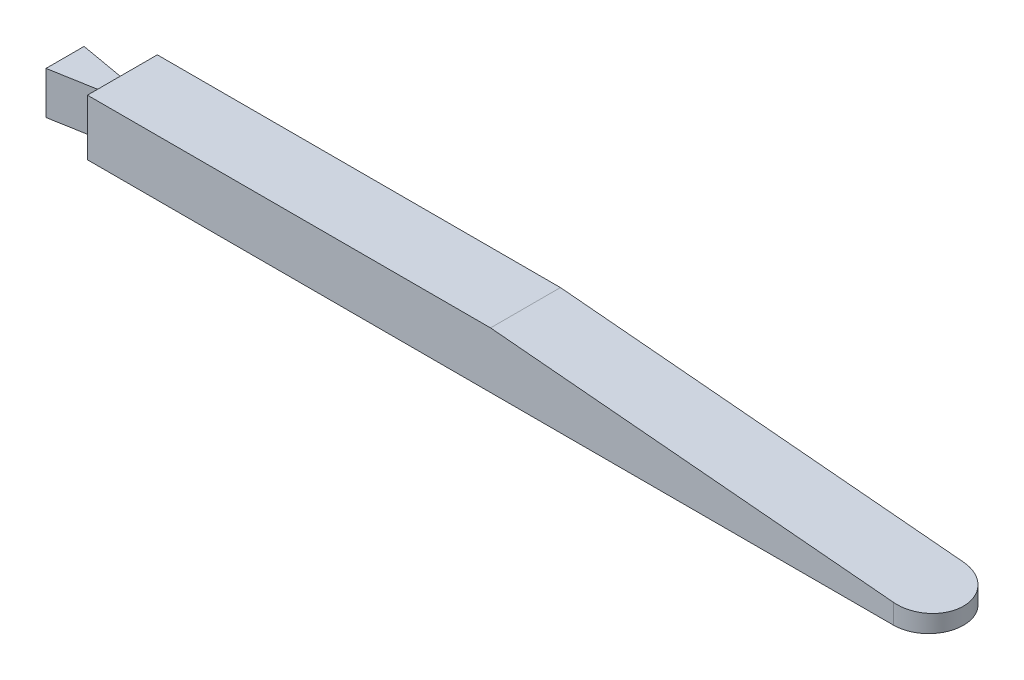
ISO-10303-21;
HEADER;
FILE_DESCRIPTION(('STEP AP214'),'2;1');
FILE_NAME('part.step','',(''),(''),'','','');
FILE_SCHEMA(('AUTOMOTIVE_DESIGN { 1 0 10303 214 1 1 1 1 }'));
ENDSEC;
DATA;
#1=APPLICATION_CONTEXT('core data for automotive mechanical design processes');
#2=APPLICATION_PROTOCOL_DEFINITION('international standard','automotive_design',2000,#1);
#3=PRODUCT_CONTEXT('',#1,'mechanical');
#4=PRODUCT('Part','Part','',(#3));
#5=PRODUCT_RELATED_PRODUCT_CATEGORY('part','',(#4));
#6=PRODUCT_DEFINITION_FORMATION('','',#4);
#7=PRODUCT_DEFINITION_CONTEXT('part definition',#1,'design');
#8=PRODUCT_DEFINITION('design','',#6,#7);
#9=PRODUCT_DEFINITION_SHAPE('','',#8);
#10=(LENGTH_UNIT() NAMED_UNIT(*) SI_UNIT(.MILLI.,.METRE.));
#11=(NAMED_UNIT(*) PLANE_ANGLE_UNIT() SI_UNIT($,.RADIAN.));
#12=(NAMED_UNIT(*) SI_UNIT($,.STERADIAN.) SOLID_ANGLE_UNIT());
#13=UNCERTAINTY_MEASURE_WITH_UNIT(LENGTH_MEASURE(1.E-05),#10,'distance_accuracy_value','');
#14=(GEOMETRIC_REPRESENTATION_CONTEXT(3) GLOBAL_UNCERTAINTY_ASSIGNED_CONTEXT((#13)) GLOBAL_UNIT_ASSIGNED_CONTEXT((#10,
#11,#12)) REPRESENTATION_CONTEXT('',''));
#15=CARTESIAN_POINT('',(0.,0.,0.));
#16=DIRECTION('',(0.,0.,1.));
#17=DIRECTION('',(1.,0.,0.));
#18=AXIS2_PLACEMENT_3D('',#15,#16,#17);
#19=CARTESIAN_POINT('',(-18.2117687991643,31.75,9.91489000000021));
#20=DIRECTION('',(-0.173648177666927,0.,0.984807753012209));
#21=DIRECTION('',(0.984807753012209,0.,0.173648177666927));
#22=AXIS2_PLACEMENT_3D('',#19,#20,#21);
#23=PLANE('',#22);
#24=DIRECTION('',(-0.984807753012209,0.,-0.173648177666927));
#25=VECTOR('',#24,1.);
#26=CARTESIAN_POINT('',(14.3002312008357,24.13,15.6476327967937));
#27=LINE('',#26,#25);
#28=CARTESIAN_POINT('',(14.3002312008357,24.13,15.6476327967937));
#29=VERTEX_POINT('',#28);
#30=CARTESIAN_POINT('',(-18.2117687991643,24.13,9.91489000000021));
#31=VERTEX_POINT('',#30);
#32=EDGE_CURVE('E198',#29,#31,#27,.T.);
#33=ORIENTED_EDGE('',*,*,#32,.F.);
#34=DIRECTION('',(0.,-1.,0.));
#35=VECTOR('',#34,1.);
#36=CARTESIAN_POINT('',(14.3002312008357,31.75,15.6476327967937));
#37=LINE('',#36,#35);
#38=CARTESIAN_POINT('',(14.3002312008357,0.,15.6476327967937));
#39=VERTEX_POINT('',#38);
#40=EDGE_CURVE('E11',#29,#39,#37,.T.);
#41=ORIENTED_EDGE('',*,*,#40,.T.);
#42=DIRECTION('',(-0.984807753012209,0.,-0.173648177666927));
#43=VECTOR('',#42,1.);
#44=CARTESIAN_POINT('',(-18.2117687991643,0.,9.91489000000021));
#45=LINE('',#44,#43);
#46=CARTESIAN_POINT('',(-18.2117687991643,0.,9.91489000000021));
#47=VERTEX_POINT('',#46);
#48=EDGE_CURVE('E124',#39,#47,#45,.T.);
#49=ORIENTED_EDGE('',*,*,#48,.T.);
#50=DIRECTION('',(0.,-1.,0.));
#51=VECTOR('',#50,1.);
#52=CARTESIAN_POINT('',(-18.2117687991643,31.75,9.91489000000021));
#53=LINE('',#52,#51);
#54=EDGE_CURVE('E53',#31,#47,#53,.T.);
#55=ORIENTED_EDGE('',*,*,#54,.F.);
#56=EDGE_LOOP('',(#33,#41,#49,#55));
#57=FACE_BOUND('',#56,.T.);
#58=ADVANCED_FACE('F45',(#57),#23,.F.);
#59=CARTESIAN_POINT('',(-18.2117687991643,31.75,9.91489000000021));
#60=DIRECTION('',(1.,0.,0.));
#61=DIRECTION('',(0.,0.,-1.));
#62=AXIS2_PLACEMENT_3D('',#59,#60,#61);
#63=PLANE('',#62);
#64=DIRECTION('',(0.,0.,1.));
#65=VECTOR('',#64,1.);
#66=CARTESIAN_POINT('',(-18.2117687991643,24.13,9.91489000000021));
#67=LINE('',#66,#65);
#68=CARTESIAN_POINT('',(-18.2117687991643,24.13,31.5048900000002));
#69=VERTEX_POINT('',#68);
#70=EDGE_CURVE('E177',#31,#69,#67,.T.);
#71=ORIENTED_EDGE('',*,*,#70,.F.);
#72=ORIENTED_EDGE('',*,*,#54,.T.);
#73=DIRECTION('',(0.,0.,1.));
#74=VECTOR('',#73,1.);
#75=CARTESIAN_POINT('',(-18.2117687991643,0.,9.91489000000021));
#76=LINE('',#75,#74);
#77=CARTESIAN_POINT('',(-18.2117687991643,0.,31.5048900000002));
#78=VERTEX_POINT('',#77);
#79=EDGE_CURVE('E130',#47,#78,#76,.T.);
#80=ORIENTED_EDGE('',*,*,#79,.T.);
#81=DIRECTION('',(0.,-1.,0.));
#82=VECTOR('',#81,1.);
#83=CARTESIAN_POINT('',(-18.2117687991643,31.75,31.5048900000002));
#84=LINE('',#83,#82);
#85=EDGE_CURVE('E166',#69,#78,#84,.T.);
#86=ORIENTED_EDGE('',*,*,#85,.F.);
#87=EDGE_LOOP('',(#71,#72,#80,#86));
#88=FACE_BOUND('',#87,.T.);
#89=ADVANCED_FACE('F172',(#88),#63,.F.);
#90=CARTESIAN_POINT('',(-18.2117687991643,31.75,31.5048900000002));
#91=DIRECTION('',(-0.173648177666935,0.,-0.984807753012207));
#92=DIRECTION('',(-0.984807753012207,0.,0.173648177666935));
#93=AXIS2_PLACEMENT_3D('',#90,#91,#92);
#94=PLANE('',#93);
#95=DIRECTION('',(0.984807753012207,0.,-0.173648177666935));
#96=VECTOR('',#95,1.);
#97=CARTESIAN_POINT('',(-18.2117687991643,24.13,31.5048900000002));
#98=LINE('',#97,#96);
#99=CARTESIAN_POINT('',(14.3002312008357,24.13,25.7721472032064));
#100=VERTEX_POINT('',#99);
#101=EDGE_CURVE('E133',#69,#100,#98,.T.);
#102=ORIENTED_EDGE('',*,*,#101,.F.);
#103=ORIENTED_EDGE('',*,*,#85,.T.);
#104=DIRECTION('',(0.984807753012207,0.,-0.173648177666935));
#105=VECTOR('',#104,1.);
#106=CARTESIAN_POINT('',(-18.2117687991643,0.,31.5048900000002));
#107=LINE('',#106,#105);
#108=CARTESIAN_POINT('',(14.3002312008357,0.,25.7721472032064));
#109=VERTEX_POINT('',#108);
#110=EDGE_CURVE('E141',#78,#109,#107,.T.);
#111=ORIENTED_EDGE('',*,*,#110,.T.);
#112=DIRECTION('',(0.,-1.,0.));
#113=VECTOR('',#112,1.);
#114=CARTESIAN_POINT('',(14.3002312008357,31.75,25.7721472032064));
#115=LINE('',#114,#113);
#116=EDGE_CURVE('E163',#100,#109,#115,.T.);
#117=ORIENTED_EDGE('',*,*,#116,.F.);
#118=EDGE_LOOP('',(#102,#103,#111,#117));
#119=FACE_BOUND('',#118,.T.);
#120=ADVANCED_FACE('F185',(#119),#94,.F.);
#121=CARTESIAN_POINT('',(14.3002312008357,31.75,40.5218900000002));
#122=DIRECTION('',(1.,0.,0.));
#123=DIRECTION('',(0.,0.,-1.));
#124=AXIS2_PLACEMENT_3D('',#121,#122,#123);
#125=PLANE('',#124);
#126=DIRECTION('',(0.,0.,1.));
#127=VECTOR('',#126,1.);
#128=CARTESIAN_POINT('',(14.3002312008357,0.,40.5218900000002));
#129=LINE('',#128,#127);
#130=CARTESIAN_POINT('',(14.3002312008357,0.,40.5218900000002));
#131=VERTEX_POINT('',#130);
#132=EDGE_CURVE('E145',#109,#131,#129,.T.);
#133=ORIENTED_EDGE('',*,*,#132,.T.);
#134=DIRECTION('',(0.,-1.,0.));
#135=VECTOR('',#134,1.);
#136=CARTESIAN_POINT('',(14.3002312008357,31.75,40.5218900000002));
#137=LINE('',#136,#135);
#138=CARTESIAN_POINT('',(14.3002312008357,31.75,40.5218900000002));
#139=VERTEX_POINT('',#138);
#140=EDGE_CURVE('E159',#139,#131,#137,.T.);
#141=ORIENTED_EDGE('',*,*,#140,.F.);
#142=DIRECTION('',(0.,0.,1.));
#143=VECTOR('',#142,1.);
#144=CARTESIAN_POINT('',(14.3002312008357,31.75,0.897890000000207));
#145=LINE('',#144,#143);
#146=CARTESIAN_POINT('',(14.3002312008357,31.75,0.897890000000207));
#147=VERTEX_POINT('',#146);
#148=EDGE_CURVE('E109',#147,#139,#145,.T.);
#149=ORIENTED_EDGE('',*,*,#148,.F.);
#150=DIRECTION('',(0.,-1.,0.));
#151=VECTOR('',#150,1.);
#152=CARTESIAN_POINT('',(14.3002312008357,31.75,0.897890000000207));
#153=LINE('',#152,#151);
#154=CARTESIAN_POINT('',(14.3002312008357,0.,0.897890000000207));
#155=VERTEX_POINT('',#154);
#156=EDGE_CURVE('E100',#147,#155,#153,.T.);
#157=ORIENTED_EDGE('',*,*,#156,.T.);
#158=DIRECTION('',(0.,0.,1.));
#159=VECTOR('',#158,1.);
#160=CARTESIAN_POINT('',(14.3002312008357,0.,0.897890000000207));
#161=LINE('',#160,#159);
#162=EDGE_CURVE('E116',#155,#39,#161,.T.);
#163=ORIENTED_EDGE('',*,*,#162,.T.);
#164=ORIENTED_EDGE('',*,*,#40,.F.);
#165=DIRECTION('',(0.,0.,-1.));
#166=VECTOR('',#165,1.);
#167=CARTESIAN_POINT('',(14.3002312008357,24.13,25.7721472032064));
#168=LINE('',#167,#166);
#169=EDGE_CURVE('E126',#100,#29,#168,.T.);
#170=ORIENTED_EDGE('',*,*,#169,.F.);
#171=ORIENTED_EDGE('',*,*,#116,.T.);
#172=EDGE_LOOP('',(#133,#141,#149,#157,#163,#164,#170,#171));
#173=FACE_BOUND('',#172,.T.);
#174=ADVANCED_FACE('F114',(#173),#125,.F.);
#175=CARTESIAN_POINT('',(14.3002312008357,31.75,40.5218900000002));
#176=DIRECTION('',(0.,0.,-1.));
#177=DIRECTION('',(-1.,0.,0.));
#178=AXIS2_PLACEMENT_3D('',#175,#176,#177);
#179=PLANE('',#178);
#180=DIRECTION('',(0.,-1.,0.));
#181=VECTOR('',#180,1.);
#182=CARTESIAN_POINT('',(471.500231200836,31.75,40.5218900000002));
#183=LINE('',#182,#181);
#184=CARTESIAN_POINT('',(471.500231200836,11.2057251392889,40.5218900000002));
#185=VERTEX_POINT('',#184);
#186=CARTESIAN_POINT('',(471.500231200836,0.,40.5218900000002));
#187=VERTEX_POINT('',#186);
#188=EDGE_CURVE('E156',#185,#187,#183,.T.);
#189=ORIENTED_EDGE('',*,*,#188,.F.);
#190=DIRECTION('',(0.995985992739676,-0.0895092300623889,0.));
#191=VECTOR('',#190,1.);
#192=CARTESIAN_POINT('',(242.900231200836,31.75,40.5218900000002));
#193=LINE('',#192,#191);
#194=CARTESIAN_POINT('',(242.900231200836,31.75,40.5218900000002));
#195=VERTEX_POINT('',#194);
#196=EDGE_CURVE('E227',#195,#185,#193,.T.);
#197=ORIENTED_EDGE('',*,*,#196,.F.);
#198=DIRECTION('',(1.,0.,0.));
#199=VECTOR('',#198,1.);
#200=CARTESIAN_POINT('',(14.3002312008357,31.75,40.5218900000002));
#201=LINE('',#200,#199);
#202=EDGE_CURVE('E213',#139,#195,#201,.T.);
#203=ORIENTED_EDGE('',*,*,#202,.F.);
#204=ORIENTED_EDGE('',*,*,#140,.T.);
#205=DIRECTION('',(1.,0.,0.));
#206=VECTOR('',#205,1.);
#207=CARTESIAN_POINT('',(14.3002312008357,0.,40.5218900000002));
#208=LINE('',#207,#206);
#209=EDGE_CURVE('E148',#131,#187,#208,.T.);
#210=ORIENTED_EDGE('',*,*,#209,.T.);
#211=EDGE_LOOP('',(#189,#197,#203,#204,#210));
#212=FACE_BOUND('',#211,.T.);
#213=ADVANCED_FACE('F225',(#212),#179,.F.);
#214=CARTESIAN_POINT('',(471.500231200836,31.75,20.7098900000002));
#215=DIRECTION('',(0.,-1.,0.));
#216=DIRECTION('',(0.,0.,-1.));
#217=AXIS2_PLACEMENT_3D('',#214,#215,#216);
#218=CYLINDRICAL_SURFACE('',#217,19.812);
#219=CARTESIAN_POINT('',(471.500231200836,11.2057251392889,20.7098900000002));
#220=DIRECTION('',(-0.0895092300623889,-0.995985992739676,0.));
#221=DIRECTION('',(0.995985992739676,-0.0895092300623889,0.));
#222=AXIS2_PLACEMENT_3D('',#219,#220,#221);
#223=ELLIPSE('',#222,19.8918460143227,19.812);
#224=CARTESIAN_POINT('',(471.500231200836,11.2057251392889,0.8978900000002));
#225=VERTEX_POINT('',#224);
#226=EDGE_CURVE('E200',#225,#185,#223,.T.);
#227=ORIENTED_EDGE('',*,*,#226,.T.);
#228=ORIENTED_EDGE('',*,*,#188,.T.);
#229=CARTESIAN_POINT('',(471.500231200836,0.,20.7098900000002));
#230=DIRECTION('',(0.,1.,0.));
#231=DIRECTION('',(0.,0.,1.));
#232=AXIS2_PLACEMENT_3D('',#229,#230,#231);
#233=CIRCLE('',#232,19.812);
#234=CARTESIAN_POINT('',(471.500231200836,0.,0.897890000000207));
#235=VERTEX_POINT('',#234);
#236=EDGE_CURVE('E110',#187,#235,#233,.T.);
#237=ORIENTED_EDGE('',*,*,#236,.T.);
#238=DIRECTION('',(0.,-1.,0.));
#239=VECTOR('',#238,1.);
#240=CARTESIAN_POINT('',(471.500231200836,31.75,0.897890000000207));
#241=LINE('',#240,#239);
#242=EDGE_CURVE('E103',#225,#235,#241,.T.);
#243=ORIENTED_EDGE('',*,*,#242,.F.);
#244=EDGE_LOOP('',(#227,#228,#237,#243));
#245=FACE_BOUND('',#244,.T.);
#246=ADVANCED_FACE('F255',(#245),#218,.T.);
#247=CARTESIAN_POINT('',(14.3002312008357,31.75,0.897890000000207));
#248=DIRECTION('',(0.,0.,1.));
#249=DIRECTION('',(1.,0.,0.));
#250=AXIS2_PLACEMENT_3D('',#247,#248,#249);
#251=PLANE('',#250);
#252=DIRECTION('',(-1.,0.,0.));
#253=VECTOR('',#252,1.);
#254=CARTESIAN_POINT('',(14.3002312008357,31.75,0.897890000000207));
#255=LINE('',#254,#253);
#256=CARTESIAN_POINT('',(242.900231200836,31.75,0.897890000000207));
#257=VERTEX_POINT('',#256);
#258=EDGE_CURVE('E68',#257,#147,#255,.T.);
#259=ORIENTED_EDGE('',*,*,#258,.F.);
#260=DIRECTION('',(0.995985992739676,-0.0895092300623889,0.));
#261=VECTOR('',#260,1.);
#262=CARTESIAN_POINT('',(242.900231200836,31.75,0.8978900000002));
#263=LINE('',#262,#261);
#264=EDGE_CURVE('E60',#257,#225,#263,.T.);
#265=ORIENTED_EDGE('',*,*,#264,.T.);
#266=ORIENTED_EDGE('',*,*,#242,.T.);
#267=DIRECTION('',(-1.,0.,0.));
#268=VECTOR('',#267,1.);
#269=CARTESIAN_POINT('',(14.3002312008357,0.,0.897890000000207));
#270=LINE('',#269,#268);
#271=EDGE_CURVE('E97',#235,#155,#270,.T.);
#272=ORIENTED_EDGE('',*,*,#271,.T.);
#273=ORIENTED_EDGE('',*,*,#156,.F.);
#274=EDGE_LOOP('',(#259,#265,#266,#272,#273));
#275=FACE_BOUND('',#274,.T.);
#276=ADVANCED_FACE('F99',(#275),#251,.F.);
#277=CARTESIAN_POINT('',(471.500231200836,31.75,20.7098900000002));
#278=DIRECTION('',(0.,1.,0.));
#279=DIRECTION('',(0.,0.,1.));
#280=AXIS2_PLACEMENT_3D('',#277,#278,#279);
#281=PLANE('',#280);
#282=DIRECTION('',(0.,0.,1.));
#283=VECTOR('',#282,1.);
#284=CARTESIAN_POINT('',(242.900231200836,31.75,0.8978900000002));
#285=LINE('',#284,#283);
#286=EDGE_CURVE('E206',#257,#195,#285,.T.);
#287=ORIENTED_EDGE('',*,*,#286,.F.);
#288=ORIENTED_EDGE('',*,*,#258,.T.);
#289=ORIENTED_EDGE('',*,*,#148,.T.);
#290=ORIENTED_EDGE('',*,*,#202,.T.);
#291=EDGE_LOOP('',(#287,#288,#289,#290));
#292=FACE_BOUND('',#291,.T.);
#293=ADVANCED_FACE('F219',(#292),#281,.T.);
#294=CARTESIAN_POINT('',(471.500231200836,0.,20.7098900000002));
#295=DIRECTION('',(0.,1.,0.));
#296=DIRECTION('',(0.,0.,1.));
#297=AXIS2_PLACEMENT_3D('',#294,#295,#296);
#298=PLANE('',#297);
#299=ORIENTED_EDGE('',*,*,#162,.F.);
#300=ORIENTED_EDGE('',*,*,#271,.F.);
#301=ORIENTED_EDGE('',*,*,#236,.F.);
#302=ORIENTED_EDGE('',*,*,#209,.F.);
#303=ORIENTED_EDGE('',*,*,#132,.F.);
#304=ORIENTED_EDGE('',*,*,#110,.F.);
#305=ORIENTED_EDGE('',*,*,#79,.F.);
#306=ORIENTED_EDGE('',*,*,#48,.F.);
#307=EDGE_LOOP('',(#299,#300,#301,#302,#303,#304,#305,#306));
#308=FACE_BOUND('',#307,.T.);
#309=ADVANCED_FACE('F121',(#308),#298,.F.);
#310=CARTESIAN_POINT('',(0.,24.13,0.));
#311=DIRECTION('',(0.,1.,0.));
#312=DIRECTION('',(0.,0.,1.));
#313=AXIS2_PLACEMENT_3D('',#310,#311,#312);
#314=PLANE('',#313);
#315=ORIENTED_EDGE('',*,*,#32,.T.);
#316=ORIENTED_EDGE('',*,*,#70,.T.);
#317=ORIENTED_EDGE('',*,*,#101,.T.);
#318=ORIENTED_EDGE('',*,*,#169,.T.);
#319=EDGE_LOOP('',(#315,#316,#317,#318));
#320=FACE_BOUND('',#319,.T.);
#321=ADVANCED_FACE('F197',(#320),#314,.T.);
#322=CARTESIAN_POINT('',(242.900231200836,31.75,0.8978900000002));
#323=DIRECTION('',(-0.0895092300623889,-0.995985992739676,0.));
#324=DIRECTION('',(0.995985992739676,-0.0895092300623889,0.));
#325=AXIS2_PLACEMENT_3D('',#322,#323,#324);
#326=PLANE('',#325);
#327=ORIENTED_EDGE('',*,*,#226,.F.);
#328=ORIENTED_EDGE('',*,*,#264,.F.);
#329=ORIENTED_EDGE('',*,*,#286,.T.);
#330=ORIENTED_EDGE('',*,*,#196,.T.);
#331=EDGE_LOOP('',(#327,#328,#329,#330));
#332=FACE_BOUND('',#331,.T.);
#333=ADVANCED_FACE('F233',(#332),#326,.F.);
#334=CLOSED_SHELL('',(#58,#89,#120,#174,#213,#246,#276,#293,#309,#321,#333));
#335=MANIFOLD_SOLID_BREP('B2',#334);
#336=ADVANCED_BREP_SHAPE_REPRESENTATION('',(#18,#335),#14);
#337=SHAPE_DEFINITION_REPRESENTATION(#9,#336);
ENDSEC;
END-ISO-10303-21;
